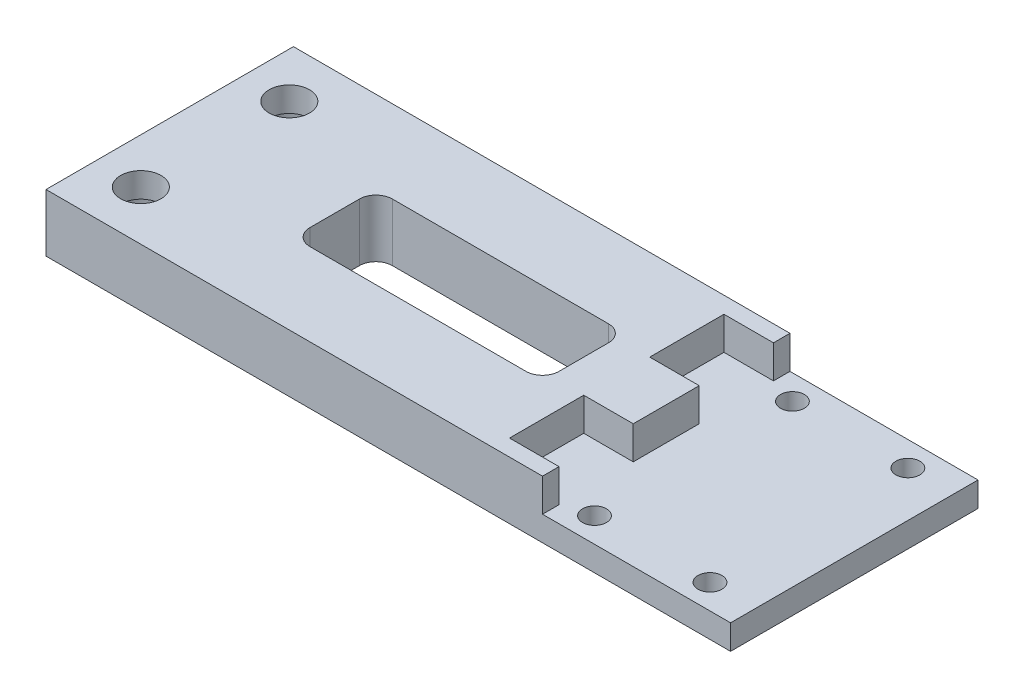
ISO-10303-21;
HEADER;
FILE_DESCRIPTION(('STEP AP214'),'2;1');
FILE_NAME('part.step','',(''),(''),'','','');
FILE_SCHEMA(('AUTOMOTIVE_DESIGN { 1 0 10303 214 1 1 1 1 }'));
ENDSEC;
DATA;
#1=APPLICATION_CONTEXT('core data for automotive mechanical design processes');
#2=APPLICATION_PROTOCOL_DEFINITION('international standard','automotive_design',2000,#1);
#3=PRODUCT_CONTEXT('',#1,'mechanical');
#4=PRODUCT('Part','Part','',(#3));
#5=PRODUCT_RELATED_PRODUCT_CATEGORY('part','',(#4));
#6=PRODUCT_DEFINITION_FORMATION('','',#4);
#7=PRODUCT_DEFINITION_CONTEXT('part definition',#1,'design');
#8=PRODUCT_DEFINITION('design','',#6,#7);
#9=PRODUCT_DEFINITION_SHAPE('','',#8);
#10=(LENGTH_UNIT() NAMED_UNIT(*) SI_UNIT(.MILLI.,.METRE.));
#11=(NAMED_UNIT(*) PLANE_ANGLE_UNIT() SI_UNIT($,.RADIAN.));
#12=(NAMED_UNIT(*) SI_UNIT($,.STERADIAN.) SOLID_ANGLE_UNIT());
#13=UNCERTAINTY_MEASURE_WITH_UNIT(LENGTH_MEASURE(1.E-05),#10,'distance_accuracy_value','');
#14=(GEOMETRIC_REPRESENTATION_CONTEXT(3) GLOBAL_UNCERTAINTY_ASSIGNED_CONTEXT((#13)) GLOBAL_UNIT_ASSIGNED_CONTEXT((#10,
#11,#12)) REPRESENTATION_CONTEXT('',''));
#15=CARTESIAN_POINT('',(0.,0.,0.));
#16=DIRECTION('',(0.,0.,1.));
#17=DIRECTION('',(1.,0.,0.));
#18=AXIS2_PLACEMENT_3D('',#15,#16,#17);
#19=CARTESIAN_POINT('',(-27.8,2.,-30.));
#20=DIRECTION('',(-1.,0.,0.));
#21=DIRECTION('',(0.,0.,1.));
#22=AXIS2_PLACEMENT_3D('',#19,#20,#21);
#23=PLANE('',#22);
#24=DIRECTION('',(0.,0.,1.));
#25=VECTOR('',#24,1.);
#26=CARTESIAN_POINT('',(-27.8,3.,-30.));
#27=LINE('',#26,#25);
#28=CARTESIAN_POINT('',(-27.8,3.,-1.99999999999999));
#29=VERTEX_POINT('',#28);
#30=CARTESIAN_POINT('',(-27.8,3.,0.));
#31=VERTEX_POINT('',#30);
#32=EDGE_CURVE('E193',#29,#31,#27,.T.);
#33=ORIENTED_EDGE('',*,*,#32,.F.);
#34=DIRECTION('',(0.,-1.,0.));
#35=VECTOR('',#34,1.);
#36=CARTESIAN_POINT('',(-27.8,7.,-1.99999999999999));
#37=LINE('',#36,#35);
#38=CARTESIAN_POINT('',(-27.8,7.,-1.99999999999999));
#39=VERTEX_POINT('',#38);
#40=EDGE_CURVE('E204',#39,#29,#37,.T.);
#41=ORIENTED_EDGE('',*,*,#40,.F.);
#42=DIRECTION('',(0.,0.,-1.));
#43=VECTOR('',#42,1.);
#44=CARTESIAN_POINT('',(-27.8,7.,0.));
#45=LINE('',#44,#43);
#46=CARTESIAN_POINT('',(-27.8,7.,0.));
#47=VERTEX_POINT('',#46);
#48=EDGE_CURVE('E263',#47,#39,#45,.T.);
#49=ORIENTED_EDGE('',*,*,#48,.F.);
#50=DIRECTION('',(0.,1.,0.));
#51=VECTOR('',#50,1.);
#52=CARTESIAN_POINT('',(-27.8,2.,0.));
#53=LINE('',#52,#51);
#54=EDGE_CURVE('E212',#31,#47,#53,.T.);
#55=ORIENTED_EDGE('',*,*,#54,.F.);
#56=EDGE_LOOP('',(#33,#41,#49,#55));
#57=FACE_BOUND('',#56,.T.);
#58=ADVANCED_FACE('F37',(#57),#23,.F.);
#59=CARTESIAN_POINT('',(-82.5,-8.,-5.99999999999998));
#60=DIRECTION('',(0.,1.,0.));
#61=DIRECTION('',(0.,0.,1.));
#62=AXIS2_PLACEMENT_3D('',#59,#60,#61);
#63=CYLINDRICAL_SURFACE('',#62,2.45);
#64=CARTESIAN_POINT('',(-82.5,7.,-5.99999999999998));
#65=DIRECTION('',(0.,1.,0.));
#66=DIRECTION('',(0.,0.,1.));
#67=AXIS2_PLACEMENT_3D('',#64,#65,#66);
#68=CIRCLE('',#67,2.45);
#69=CARTESIAN_POINT('',(-82.5,7.,-3.54999999999999));
#70=VERTEX_POINT('',#69);
#71=EDGE_CURVE('E256',#70,#70,#68,.T.);
#72=ORIENTED_EDGE('',*,*,#71,.T.);
#73=EDGE_LOOP('',(#72));
#74=FACE_BOUND('',#73,.T.);
#75=CARTESIAN_POINT('',(-82.5,4.,-5.99999999999998));
#76=DIRECTION('',(0.,-1.,0.));
#77=DIRECTION('',(0.,0.,-1.));
#78=AXIS2_PLACEMENT_3D('',#75,#76,#77);
#79=CIRCLE('',#78,2.45);
#80=CARTESIAN_POINT('',(-82.5,4.,-8.44999999999998));
#81=VERTEX_POINT('',#80);
#82=EDGE_CURVE('E41',#81,#81,#79,.F.);
#83=ORIENTED_EDGE('',*,*,#82,.F.);
#84=EDGE_LOOP('',(#83));
#85=FACE_BOUND('',#84,.T.);
#86=ADVANCED_FACE('F425',(#74,#85),#63,.F.);
#87=CARTESIAN_POINT('',(-82.5,-8.,-24.));
#88=DIRECTION('',(0.,1.,0.));
#89=DIRECTION('',(0.,0.,1.));
#90=AXIS2_PLACEMENT_3D('',#87,#88,#89);
#91=CYLINDRICAL_SURFACE('',#90,2.45);
#92=CARTESIAN_POINT('',(-82.5,7.,-24.));
#93=DIRECTION('',(0.,1.,0.));
#94=DIRECTION('',(0.,0.,1.));
#95=AXIS2_PLACEMENT_3D('',#92,#93,#94);
#96=CIRCLE('',#95,2.45);
#97=CARTESIAN_POINT('',(-82.5,7.,-21.55));
#98=VERTEX_POINT('',#97);
#99=EDGE_CURVE('E253',#98,#98,#96,.T.);
#100=ORIENTED_EDGE('',*,*,#99,.T.);
#101=EDGE_LOOP('',(#100));
#102=FACE_BOUND('',#101,.T.);
#103=CARTESIAN_POINT('',(-82.5,4.,-24.));
#104=DIRECTION('',(0.,-1.,0.));
#105=DIRECTION('',(0.,0.,-1.));
#106=AXIS2_PLACEMENT_3D('',#103,#104,#105);
#107=CIRCLE('',#106,2.45);
#108=CARTESIAN_POINT('',(-82.5,4.,-26.45));
#109=VERTEX_POINT('',#108);
#110=EDGE_CURVE('E335',#109,#109,#107,.F.);
#111=ORIENTED_EDGE('',*,*,#110,.F.);
#112=EDGE_LOOP('',(#111));
#113=FACE_BOUND('',#112,.T.);
#114=ADVANCED_FACE('F402',(#102,#113),#91,.F.);
#115=CARTESIAN_POINT('',(0.,3.,0.));
#116=DIRECTION('',(0.,1.,0.));
#117=DIRECTION('',(0.,0.,1.));
#118=AXIS2_PLACEMENT_3D('',#115,#116,#117);
#119=PLANE('',#118);
#120=CARTESIAN_POINT('',(-10.5,3.,-27.));
#121=DIRECTION('',(0.,1.,0.));
#122=DIRECTION('',(0.,0.,1.));
#123=AXIS2_PLACEMENT_3D('',#120,#121,#122);
#124=CIRCLE('',#123,1.45);
#125=CARTESIAN_POINT('',(-10.5,3.,-25.55));
#126=VERTEX_POINT('',#125);
#127=EDGE_CURVE('E392',#126,#126,#124,.T.);
#128=ORIENTED_EDGE('',*,*,#127,.F.);
#129=EDGE_LOOP('',(#128));
#130=FACE_BOUND('',#129,.T.);
#131=CARTESIAN_POINT('',(-10.5,3.,-3.));
#132=DIRECTION('',(0.,1.,0.));
#133=DIRECTION('',(0.,0.,1.));
#134=AXIS2_PLACEMENT_3D('',#131,#132,#133);
#135=CIRCLE('',#134,1.45);
#136=CARTESIAN_POINT('',(-10.5,3.,-1.55));
#137=VERTEX_POINT('',#136);
#138=EDGE_CURVE('E214',#137,#137,#135,.T.);
#139=ORIENTED_EDGE('',*,*,#138,.F.);
#140=EDGE_LOOP('',(#139));
#141=FACE_BOUND('',#140,.T.);
#142=CARTESIAN_POINT('',(-24.5,3.,-27.));
#143=DIRECTION('',(0.,1.,0.));
#144=DIRECTION('',(0.,0.,1.));
#145=AXIS2_PLACEMENT_3D('',#142,#143,#144);
#146=CIRCLE('',#145,1.45);
#147=CARTESIAN_POINT('',(-24.5,3.,-25.55));
#148=VERTEX_POINT('',#147);
#149=EDGE_CURVE('E218',#148,#148,#146,.T.);
#150=ORIENTED_EDGE('',*,*,#149,.F.);
#151=EDGE_LOOP('',(#150));
#152=FACE_BOUND('',#151,.T.);
#153=CARTESIAN_POINT('',(-24.5,3.,-3.));
#154=DIRECTION('',(0.,1.,0.));
#155=DIRECTION('',(0.,0.,1.));
#156=AXIS2_PLACEMENT_3D('',#153,#154,#155);
#157=CIRCLE('',#156,1.45);
#158=CARTESIAN_POINT('',(-24.5,3.,-1.55));
#159=VERTEX_POINT('',#158);
#160=EDGE_CURVE('E389',#159,#159,#157,.T.);
#161=ORIENTED_EDGE('',*,*,#160,.F.);
#162=EDGE_LOOP('',(#161));
#163=FACE_BOUND('',#162,.T.);
#164=DIRECTION('',(-1.,0.,0.));
#165=VECTOR('',#164,1.);
#166=CARTESIAN_POINT('',(-27.8,3.,-19.));
#167=LINE('',#166,#165);
#168=CARTESIAN_POINT('',(-27.8,3.,-19.));
#169=VERTEX_POINT('',#168);
#170=CARTESIAN_POINT('',(-33.8,3.,-19.));
#171=VERTEX_POINT('',#170);
#172=EDGE_CURVE('E362',#169,#171,#167,.T.);
#173=ORIENTED_EDGE('',*,*,#172,.F.);
#174=CARTESIAN_POINT('',(-27.8,3.,-11.));
#175=VERTEX_POINT('',#174);
#176=EDGE_CURVE('E62',#169,#175,#27,.T.);
#177=ORIENTED_EDGE('',*,*,#176,.T.);
#178=DIRECTION('',(1.,0.,0.));
#179=VECTOR('',#178,1.);
#180=CARTESIAN_POINT('',(-43.6488578017961,3.,-11.));
#181=LINE('',#180,#179);
#182=CARTESIAN_POINT('',(-33.8,3.,-11.));
#183=VERTEX_POINT('',#182);
#184=EDGE_CURVE('E200',#183,#175,#181,.T.);
#185=ORIENTED_EDGE('',*,*,#184,.F.);
#186=DIRECTION('',(0.,0.,1.));
#187=VECTOR('',#186,1.);
#188=CARTESIAN_POINT('',(-33.8,3.,-1.99999999999999));
#189=LINE('',#188,#187);
#190=CARTESIAN_POINT('',(-33.8,3.,-1.99999999999999));
#191=VERTEX_POINT('',#190);
#192=EDGE_CURVE('E197',#183,#191,#189,.T.);
#193=ORIENTED_EDGE('',*,*,#192,.T.);
#194=DIRECTION('',(1.,0.,0.));
#195=VECTOR('',#194,1.);
#196=CARTESIAN_POINT('',(-43.6488578017961,3.,-1.99999999999999));
#197=LINE('',#196,#195);
#198=EDGE_CURVE('E188',#191,#29,#197,.T.);
#199=ORIENTED_EDGE('',*,*,#198,.T.);
#200=ORIENTED_EDGE('',*,*,#32,.T.);
#201=DIRECTION('',(1.,0.,0.));
#202=VECTOR('',#201,1.);
#203=CARTESIAN_POINT('',(-27.8,3.,0.));
#204=LINE('',#203,#202);
#205=CARTESIAN_POINT('',(-5.,3.,0.));
#206=VERTEX_POINT('',#205);
#207=EDGE_CURVE('E216',#31,#206,#204,.T.);
#208=ORIENTED_EDGE('',*,*,#207,.T.);
#209=DIRECTION('',(0.,0.,-1.));
#210=VECTOR('',#209,1.);
#211=CARTESIAN_POINT('',(-5.,3.,0.));
#212=LINE('',#211,#210);
#213=CARTESIAN_POINT('',(-5.,3.,-30.));
#214=VERTEX_POINT('',#213);
#215=EDGE_CURVE('E223',#206,#214,#212,.T.);
#216=ORIENTED_EDGE('',*,*,#215,.T.);
#217=DIRECTION('',(-1.,0.,0.));
#218=VECTOR('',#217,1.);
#219=CARTESIAN_POINT('',(-5.,3.,-30.));
#220=LINE('',#219,#218);
#221=CARTESIAN_POINT('',(-27.8,3.,-30.));
#222=VERTEX_POINT('',#221);
#223=EDGE_CURVE('E226',#214,#222,#220,.T.);
#224=ORIENTED_EDGE('',*,*,#223,.T.);
#225=DIRECTION('',(0.,0.,-1.));
#226=VECTOR('',#225,1.);
#227=CARTESIAN_POINT('',(-27.8,3.,-30.));
#228=LINE('',#227,#226);
#229=CARTESIAN_POINT('',(-27.8,3.,-28.));
#230=VERTEX_POINT('',#229);
#231=EDGE_CURVE('E376',#230,#222,#228,.T.);
#232=ORIENTED_EDGE('',*,*,#231,.F.);
#233=DIRECTION('',(-1.,0.,0.));
#234=VECTOR('',#233,1.);
#235=CARTESIAN_POINT('',(-27.8,3.,-28.));
#236=LINE('',#235,#234);
#237=CARTESIAN_POINT('',(-33.8,3.,-28.));
#238=VERTEX_POINT('',#237);
#239=EDGE_CURVE('E378',#230,#238,#236,.T.);
#240=ORIENTED_EDGE('',*,*,#239,.T.);
#241=DIRECTION('',(0.,0.,-1.));
#242=VECTOR('',#241,1.);
#243=CARTESIAN_POINT('',(-33.8,3.,-30.));
#244=LINE('',#243,#242);
#245=EDGE_CURVE('E385',#171,#238,#244,.T.);
#246=ORIENTED_EDGE('',*,*,#245,.F.);
#247=EDGE_LOOP('',(#173,#177,#185,#193,#199,#200,#208,#216,#224,#232,#240,#246));
#248=FACE_BOUND('',#247,.T.);
#249=ADVANCED_FACE('F190',(#130,#141,#152,#163,#248),#119,.T.);
#250=CARTESIAN_POINT('',(-33.8,0.,0.));
#251=DIRECTION('',(1.,0.,0.));
#252=DIRECTION('',(0.,0.,-1.));
#253=AXIS2_PLACEMENT_3D('',#250,#251,#252);
#254=PLANE('',#253);
#255=DIRECTION('',(0.,1.,0.));
#256=VECTOR('',#255,1.);
#257=CARTESIAN_POINT('',(-33.8,3.,-19.));
#258=LINE('',#257,#256);
#259=CARTESIAN_POINT('',(-33.8,7.,-19.));
#260=VERTEX_POINT('',#259);
#261=EDGE_CURVE('E365',#171,#260,#258,.T.);
#262=ORIENTED_EDGE('',*,*,#261,.F.);
#263=ORIENTED_EDGE('',*,*,#245,.T.);
#264=DIRECTION('',(0.,-1.,0.));
#265=VECTOR('',#264,1.);
#266=CARTESIAN_POINT('',(-33.8,7.,-28.));
#267=LINE('',#266,#265);
#268=CARTESIAN_POINT('',(-33.8,7.,-28.));
#269=VERTEX_POINT('',#268);
#270=EDGE_CURVE('E368',#269,#238,#267,.T.);
#271=ORIENTED_EDGE('',*,*,#270,.F.);
#272=DIRECTION('',(0.,0.,1.));
#273=VECTOR('',#272,1.);
#274=CARTESIAN_POINT('',(-33.8,7.,-30.));
#275=LINE('',#274,#273);
#276=EDGE_CURVE('E387',#269,#260,#275,.T.);
#277=ORIENTED_EDGE('',*,*,#276,.T.);
#278=EDGE_LOOP('',(#262,#263,#271,#277));
#279=FACE_BOUND('',#278,.T.);
#280=ADVANCED_FACE('F401',(#279),#254,.T.);
#281=CARTESIAN_POINT('',(0.,3.,-30.));
#282=DIRECTION('',(0.,0.,1.));
#283=DIRECTION('',(1.,0.,0.));
#284=AXIS2_PLACEMENT_3D('',#281,#282,#283);
#285=PLANE('',#284);
#286=DIRECTION('',(-1.,0.,0.));
#287=VECTOR('',#286,1.);
#288=CARTESIAN_POINT('',(-27.8,7.,-30.));
#289=LINE('',#288,#287);
#290=CARTESIAN_POINT('',(-27.8,7.,-30.));
#291=VERTEX_POINT('',#290);
#292=CARTESIAN_POINT('',(-88.,7.,-30.));
#293=VERTEX_POINT('',#292);
#294=EDGE_CURVE('E265',#291,#293,#289,.T.);
#295=ORIENTED_EDGE('',*,*,#294,.F.);
#296=DIRECTION('',(0.,1.,0.));
#297=VECTOR('',#296,1.);
#298=CARTESIAN_POINT('',(-27.8,7.,-30.));
#299=LINE('',#298,#297);
#300=EDGE_CURVE('E369',#222,#291,#299,.T.);
#301=ORIENTED_EDGE('',*,*,#300,.F.);
#302=ORIENTED_EDGE('',*,*,#223,.F.);
#303=DIRECTION('',(0.,-1.,0.));
#304=VECTOR('',#303,1.);
#305=CARTESIAN_POINT('',(-5.,10.,-30.));
#306=LINE('',#305,#304);
#307=CARTESIAN_POINT('',(-5.,0.,-30.));
#308=VERTEX_POINT('',#307);
#309=EDGE_CURVE('E273',#214,#308,#306,.T.);
#310=ORIENTED_EDGE('',*,*,#309,.T.);
#311=DIRECTION('',(-1.,0.,0.));
#312=VECTOR('',#311,1.);
#313=CARTESIAN_POINT('',(0.,0.,-30.));
#314=LINE('',#313,#312);
#315=CARTESIAN_POINT('',(-88.,0.,-30.));
#316=VERTEX_POINT('',#315);
#317=EDGE_CURVE('E290',#308,#316,#314,.T.);
#318=ORIENTED_EDGE('',*,*,#317,.T.);
#319=DIRECTION('',(0.,-1.,0.));
#320=VECTOR('',#319,1.);
#321=CARTESIAN_POINT('',(-88.,3.,-30.));
#322=LINE('',#321,#320);
#323=EDGE_CURVE('E300',#293,#316,#322,.T.);
#324=ORIENTED_EDGE('',*,*,#323,.F.);
#325=EDGE_LOOP('',(#295,#301,#302,#310,#318,#324));
#326=FACE_BOUND('',#325,.T.);
#327=ADVANCED_FACE('F471',(#326),#285,.F.);
#328=CARTESIAN_POINT('',(-88.,3.,0.));
#329=DIRECTION('',(1.,0.,0.));
#330=DIRECTION('',(0.,0.,-1.));
#331=AXIS2_PLACEMENT_3D('',#328,#329,#330);
#332=PLANE('',#331);
#333=DIRECTION('',(0.,0.,1.));
#334=VECTOR('',#333,1.);
#335=CARTESIAN_POINT('',(-88.,0.,0.));
#336=LINE('',#335,#334);
#337=CARTESIAN_POINT('',(-88.,0.,0.));
#338=VERTEX_POINT('',#337);
#339=EDGE_CURVE('E292',#316,#338,#336,.T.);
#340=ORIENTED_EDGE('',*,*,#339,.T.);
#341=DIRECTION('',(0.,-1.,0.));
#342=VECTOR('',#341,1.);
#343=CARTESIAN_POINT('',(-88.,3.,0.));
#344=LINE('',#343,#342);
#345=CARTESIAN_POINT('',(-88.,7.,0.));
#346=VERTEX_POINT('',#345);
#347=EDGE_CURVE('E297',#346,#338,#344,.T.);
#348=ORIENTED_EDGE('',*,*,#347,.F.);
#349=DIRECTION('',(0.,0.,1.));
#350=VECTOR('',#349,1.);
#351=CARTESIAN_POINT('',(-88.,7.,-30.));
#352=LINE('',#351,#350);
#353=EDGE_CURVE('E267',#293,#346,#352,.T.);
#354=ORIENTED_EDGE('',*,*,#353,.F.);
#355=ORIENTED_EDGE('',*,*,#323,.T.);
#356=EDGE_LOOP('',(#340,#348,#354,#355));
#357=FACE_BOUND('',#356,.T.);
#358=ADVANCED_FACE('F477',(#357),#332,.F.);
#359=CARTESIAN_POINT('',(0.,3.,0.));
#360=DIRECTION('',(0.,0.,-1.));
#361=DIRECTION('',(-1.,0.,0.));
#362=AXIS2_PLACEMENT_3D('',#359,#360,#361);
#363=PLANE('',#362);
#364=ORIENTED_EDGE('',*,*,#207,.F.);
#365=ORIENTED_EDGE('',*,*,#54,.T.);
#366=DIRECTION('',(1.,0.,0.));
#367=VECTOR('',#366,1.);
#368=CARTESIAN_POINT('',(-88.,7.,0.));
#369=LINE('',#368,#367);
#370=EDGE_CURVE('E259',#346,#47,#369,.T.);
#371=ORIENTED_EDGE('',*,*,#370,.F.);
#372=ORIENTED_EDGE('',*,*,#347,.T.);
#373=DIRECTION('',(1.,0.,0.));
#374=VECTOR('',#373,1.);
#375=CARTESIAN_POINT('',(0.,0.,0.));
#376=LINE('',#375,#374);
#377=CARTESIAN_POINT('',(-5.,0.,0.));
#378=VERTEX_POINT('',#377);
#379=EDGE_CURVE('E294',#338,#378,#376,.T.);
#380=ORIENTED_EDGE('',*,*,#379,.T.);
#381=DIRECTION('',(0.,-1.,0.));
#382=VECTOR('',#381,1.);
#383=CARTESIAN_POINT('',(-5.,10.,0.));
#384=LINE('',#383,#382);
#385=EDGE_CURVE('E272',#206,#378,#384,.T.);
#386=ORIENTED_EDGE('',*,*,#385,.F.);
#387=EDGE_LOOP('',(#364,#365,#371,#372,#380,#386));
#388=FACE_BOUND('',#387,.T.);
#389=ADVANCED_FACE('F437',(#388),#363,.F.);
#390=CARTESIAN_POINT('',(0.,0.,0.));
#391=DIRECTION('',(0.,1.,0.));
#392=DIRECTION('',(0.,0.,1.));
#393=AXIS2_PLACEMENT_3D('',#390,#391,#392);
#394=PLANE('',#393);
#395=CARTESIAN_POINT('',(-82.5,0.,-5.99999999999998));
#396=DIRECTION('',(0.,-1.,0.));
#397=DIRECTION('',(0.,0.,-1.));
#398=AXIS2_PLACEMENT_3D('',#395,#396,#397);
#399=CIRCLE('',#398,4.00000000000001);
#400=CARTESIAN_POINT('',(-82.5,0.,-9.99999999999999));
#401=VERTEX_POINT('',#400);
#402=EDGE_CURVE('E343',#401,#401,#399,.T.);
#403=ORIENTED_EDGE('',*,*,#402,.F.);
#404=EDGE_LOOP('',(#403));
#405=FACE_BOUND('',#404,.T.);
#406=CARTESIAN_POINT('',(-82.5,0.,-24.));
#407=DIRECTION('',(0.,-1.,0.));
#408=DIRECTION('',(0.,0.,-1.));
#409=AXIS2_PLACEMENT_3D('',#406,#407,#408);
#410=CIRCLE('',#409,4.00000000000001);
#411=CARTESIAN_POINT('',(-82.5,0.,-28.));
#412=VERTEX_POINT('',#411);
#413=EDGE_CURVE('E354',#412,#412,#410,.T.);
#414=ORIENTED_EDGE('',*,*,#413,.F.);
#415=EDGE_LOOP('',(#414));
#416=FACE_BOUND('',#415,.T.);
#417=DIRECTION('',(0.,0.,-1.));
#418=VECTOR('',#417,1.);
#419=CARTESIAN_POINT('',(-37.8,0.,0.));
#420=LINE('',#419,#418);
#421=CARTESIAN_POINT('',(-37.8,0.,-12.));
#422=VERTEX_POINT('',#421);
#423=CARTESIAN_POINT('',(-37.8,0.,-18.));
#424=VERTEX_POINT('',#423);
#425=EDGE_CURVE('E306',#422,#424,#420,.T.);
#426=ORIENTED_EDGE('',*,*,#425,.T.);
#427=CARTESIAN_POINT('',(-39.8,0.,-18.));
#428=DIRECTION('',(0.,1.,0.));
#429=DIRECTION('',(0.,0.,1.));
#430=AXIS2_PLACEMENT_3D('',#427,#428,#429);
#431=CIRCLE('',#430,2.);
#432=CARTESIAN_POINT('',(-39.8,0.,-20.));
#433=VERTEX_POINT('',#432);
#434=EDGE_CURVE('E46',#424,#433,#431,.T.);
#435=ORIENTED_EDGE('',*,*,#434,.T.);
#436=DIRECTION('',(-1.,0.,0.));
#437=VECTOR('',#436,1.);
#438=CARTESIAN_POINT('',(0.,0.,-20.));
#439=LINE('',#438,#437);
#440=CARTESIAN_POINT('',(-66.,0.,-20.));
#441=VERTEX_POINT('',#440);
#442=EDGE_CURVE('E309',#433,#441,#439,.T.);
#443=ORIENTED_EDGE('',*,*,#442,.T.);
#444=CARTESIAN_POINT('',(-66.,0.,-18.));
#445=DIRECTION('',(0.,1.,0.));
#446=DIRECTION('',(0.,0.,1.));
#447=AXIS2_PLACEMENT_3D('',#444,#445,#446);
#448=CIRCLE('',#447,2.);
#449=CARTESIAN_POINT('',(-68.,0.,-18.));
#450=VERTEX_POINT('',#449);
#451=EDGE_CURVE('E11',#441,#450,#448,.T.);
#452=ORIENTED_EDGE('',*,*,#451,.T.);
#453=DIRECTION('',(0.,0.,1.));
#454=VECTOR('',#453,1.);
#455=CARTESIAN_POINT('',(-68.,0.,0.));
#456=LINE('',#455,#454);
#457=CARTESIAN_POINT('',(-68.,0.,-12.));
#458=VERTEX_POINT('',#457);
#459=EDGE_CURVE('E312',#450,#458,#456,.T.);
#460=ORIENTED_EDGE('',*,*,#459,.T.);
#461=CARTESIAN_POINT('',(-66.,0.,-12.));
#462=DIRECTION('',(0.,1.,0.));
#463=DIRECTION('',(0.,0.,1.));
#464=AXIS2_PLACEMENT_3D('',#461,#462,#463);
#465=CIRCLE('',#464,2.);
#466=CARTESIAN_POINT('',(-66.,0.,-9.99999999999999));
#467=VERTEX_POINT('',#466);
#468=EDGE_CURVE('E331',#458,#467,#465,.T.);
#469=ORIENTED_EDGE('',*,*,#468,.T.);
#470=DIRECTION('',(1.,0.,0.));
#471=VECTOR('',#470,1.);
#472=CARTESIAN_POINT('',(0.,0.,-9.99999999999999));
#473=LINE('',#472,#471);
#474=CARTESIAN_POINT('',(-39.8,0.,-9.99999999999999));
#475=VERTEX_POINT('',#474);
#476=EDGE_CURVE('E303',#467,#475,#473,.T.);
#477=ORIENTED_EDGE('',*,*,#476,.T.);
#478=CARTESIAN_POINT('',(-39.8,0.,-12.));
#479=DIRECTION('',(0.,1.,0.));
#480=DIRECTION('',(0.,0.,1.));
#481=AXIS2_PLACEMENT_3D('',#478,#479,#480);
#482=CIRCLE('',#481,2.);
#483=EDGE_CURVE('E333',#475,#422,#482,.T.);
#484=ORIENTED_EDGE('',*,*,#483,.T.);
#485=EDGE_LOOP('',(#426,#435,#443,#452,#460,#469,#477,#484));
#486=FACE_BOUND('',#485,.T.);
#487=CARTESIAN_POINT('',(-10.5,0.,-27.));
#488=DIRECTION('',(0.,1.,0.));
#489=DIRECTION('',(0.,0.,1.));
#490=AXIS2_PLACEMENT_3D('',#487,#488,#489);
#491=CIRCLE('',#490,1.45);
#492=CARTESIAN_POINT('',(-10.5,0.,-25.55));
#493=VERTEX_POINT('',#492);
#494=EDGE_CURVE('E286',#493,#493,#491,.T.);
#495=ORIENTED_EDGE('',*,*,#494,.T.);
#496=EDGE_LOOP('',(#495));
#497=FACE_BOUND('',#496,.T.);
#498=CARTESIAN_POINT('',(-10.5,0.,-3.));
#499=DIRECTION('',(0.,1.,0.));
#500=DIRECTION('',(0.,0.,1.));
#501=AXIS2_PLACEMENT_3D('',#498,#499,#500);
#502=CIRCLE('',#501,1.45);
#503=CARTESIAN_POINT('',(-10.5,0.,-1.55));
#504=VERTEX_POINT('',#503);
#505=EDGE_CURVE('E283',#504,#504,#502,.T.);
#506=ORIENTED_EDGE('',*,*,#505,.T.);
#507=EDGE_LOOP('',(#506));
#508=FACE_BOUND('',#507,.T.);
#509=CARTESIAN_POINT('',(-24.5,0.,-3.));
#510=DIRECTION('',(0.,1.,0.));
#511=DIRECTION('',(0.,0.,1.));
#512=AXIS2_PLACEMENT_3D('',#509,#510,#511);
#513=CIRCLE('',#512,1.45);
#514=CARTESIAN_POINT('',(-24.5,0.,-1.55));
#515=VERTEX_POINT('',#514);
#516=EDGE_CURVE('E280',#515,#515,#513,.T.);
#517=ORIENTED_EDGE('',*,*,#516,.T.);
#518=EDGE_LOOP('',(#517));
#519=FACE_BOUND('',#518,.T.);
#520=CARTESIAN_POINT('',(-24.5,0.,-27.));
#521=DIRECTION('',(0.,1.,0.));
#522=DIRECTION('',(0.,0.,1.));
#523=AXIS2_PLACEMENT_3D('',#520,#521,#522);
#524=CIRCLE('',#523,1.45);
#525=CARTESIAN_POINT('',(-24.5,0.,-25.55));
#526=VERTEX_POINT('',#525);
#527=EDGE_CURVE('E276',#526,#526,#524,.T.);
#528=ORIENTED_EDGE('',*,*,#527,.T.);
#529=EDGE_LOOP('',(#528));
#530=FACE_BOUND('',#529,.T.);
#531=ORIENTED_EDGE('',*,*,#317,.F.);
#532=DIRECTION('',(0.,0.,-1.));
#533=VECTOR('',#532,1.);
#534=CARTESIAN_POINT('',(-5.,0.,0.));
#535=LINE('',#534,#533);
#536=EDGE_CURVE('E270',#378,#308,#535,.T.);
#537=ORIENTED_EDGE('',*,*,#536,.F.);
#538=ORIENTED_EDGE('',*,*,#379,.F.);
#539=ORIENTED_EDGE('',*,*,#339,.F.);
#540=EDGE_LOOP('',(#531,#537,#538,#539));
#541=FACE_BOUND('',#540,.T.);
#542=ADVANCED_FACE('F433',(#405,#416,#486,#497,#508,#519,#530,#541),#394,.F.);
#543=CARTESIAN_POINT('',(-27.8,7.,-11.));
#544=VERTEX_POINT('',#543);
#545=CARTESIAN_POINT('',(-27.8,7.,-19.));
#546=VERTEX_POINT('',#545);
#547=EDGE_CURVE('E262',#544,#546,#45,.T.);
#548=ORIENTED_EDGE('',*,*,#547,.F.);
#549=DIRECTION('',(0.,1.,0.));
#550=VECTOR('',#549,1.);
#551=CARTESIAN_POINT('',(-27.8,7.,-11.));
#552=LINE('',#551,#550);
#553=EDGE_CURVE('E201',#175,#544,#552,.T.);
#554=ORIENTED_EDGE('',*,*,#553,.F.);
#555=ORIENTED_EDGE('',*,*,#176,.F.);
#556=DIRECTION('',(0.,-1.,0.));
#557=VECTOR('',#556,1.);
#558=CARTESIAN_POINT('',(-27.8,7.,-19.));
#559=LINE('',#558,#557);
#560=EDGE_CURVE('E359',#546,#169,#559,.T.);
#561=ORIENTED_EDGE('',*,*,#560,.F.);
#562=EDGE_LOOP('',(#548,#554,#555,#561));
#563=FACE_BOUND('',#562,.T.);
#564=ADVANCED_FACE('F419',(#563),#23,.F.);
#565=CARTESIAN_POINT('',(-24.5,-9.,-27.));
#566=DIRECTION('',(0.,1.,0.));
#567=DIRECTION('',(0.,0.,1.));
#568=AXIS2_PLACEMENT_3D('',#565,#566,#567);
#569=CYLINDRICAL_SURFACE('',#568,1.45);
#570=ORIENTED_EDGE('',*,*,#527,.F.);
#571=EDGE_LOOP('',(#570));
#572=FACE_BOUND('',#571,.T.);
#573=ORIENTED_EDGE('',*,*,#149,.T.);
#574=EDGE_LOOP('',(#573));
#575=FACE_BOUND('',#574,.T.);
#576=ADVANCED_FACE('F397',(#572,#575),#569,.F.);
#577=CARTESIAN_POINT('',(-24.5,-9.,-3.));
#578=DIRECTION('',(0.,1.,0.));
#579=DIRECTION('',(0.,0.,1.));
#580=AXIS2_PLACEMENT_3D('',#577,#578,#579);
#581=CYLINDRICAL_SURFACE('',#580,1.45);
#582=ORIENTED_EDGE('',*,*,#516,.F.);
#583=EDGE_LOOP('',(#582));
#584=FACE_BOUND('',#583,.T.);
#585=ORIENTED_EDGE('',*,*,#160,.T.);
#586=EDGE_LOOP('',(#585));
#587=FACE_BOUND('',#586,.T.);
#588=ADVANCED_FACE('F407',(#584,#587),#581,.F.);
#589=CARTESIAN_POINT('',(-10.5,-9.,-3.));
#590=DIRECTION('',(0.,1.,0.));
#591=DIRECTION('',(0.,0.,1.));
#592=AXIS2_PLACEMENT_3D('',#589,#590,#591);
#593=CYLINDRICAL_SURFACE('',#592,1.45);
#594=ORIENTED_EDGE('',*,*,#505,.F.);
#595=EDGE_LOOP('',(#594));
#596=FACE_BOUND('',#595,.T.);
#597=ORIENTED_EDGE('',*,*,#138,.T.);
#598=EDGE_LOOP('',(#597));
#599=FACE_BOUND('',#598,.T.);
#600=ADVANCED_FACE('F409',(#596,#599),#593,.F.);
#601=CARTESIAN_POINT('',(-10.5,-9.,-27.));
#602=DIRECTION('',(0.,1.,0.));
#603=DIRECTION('',(0.,0.,1.));
#604=AXIS2_PLACEMENT_3D('',#601,#602,#603);
#605=CYLINDRICAL_SURFACE('',#604,1.45);
#606=ORIENTED_EDGE('',*,*,#494,.F.);
#607=EDGE_LOOP('',(#606));
#608=FACE_BOUND('',#607,.T.);
#609=ORIENTED_EDGE('',*,*,#127,.T.);
#610=EDGE_LOOP('',(#609));
#611=FACE_BOUND('',#610,.T.);
#612=ADVANCED_FACE('F416',(#608,#611),#605,.F.);
#613=CARTESIAN_POINT('',(-68.,-8.,-20.));
#614=DIRECTION('',(-1.,0.,0.));
#615=DIRECTION('',(0.,0.,1.));
#616=AXIS2_PLACEMENT_3D('',#613,#614,#615);
#617=PLANE('',#616);
#618=DIRECTION('',(0.,1.,0.));
#619=VECTOR('',#618,1.);
#620=CARTESIAN_POINT('',(-68.,3.,-18.));
#621=LINE('',#620,#619);
#622=CARTESIAN_POINT('',(-68.,7.,-18.));
#623=VERTEX_POINT('',#622);
#624=EDGE_CURVE('E319',#450,#623,#621,.T.);
#625=ORIENTED_EDGE('',*,*,#624,.T.);
#626=DIRECTION('',(0.,0.,1.));
#627=VECTOR('',#626,1.);
#628=CARTESIAN_POINT('',(-68.,7.,-18.));
#629=LINE('',#628,#627);
#630=CARTESIAN_POINT('',(-68.,7.,-12.));
#631=VERTEX_POINT('',#630);
#632=EDGE_CURVE('E238',#623,#631,#629,.T.);
#633=ORIENTED_EDGE('',*,*,#632,.T.);
#634=DIRECTION('',(0.,1.,0.));
#635=VECTOR('',#634,1.);
#636=CARTESIAN_POINT('',(-68.,0.,-12.));
#637=LINE('',#636,#635);
#638=EDGE_CURVE('E321',#631,#458,#637,.F.);
#639=ORIENTED_EDGE('',*,*,#638,.T.);
#640=ORIENTED_EDGE('',*,*,#459,.F.);
#641=EDGE_LOOP('',(#625,#633,#639,#640));
#642=FACE_BOUND('',#641,.T.);
#643=ADVANCED_FACE('F517',(#642),#617,.F.);
#644=CARTESIAN_POINT('',(-68.,-8.,-20.));
#645=DIRECTION('',(0.,0.,-1.));
#646=DIRECTION('',(-1.,0.,0.));
#647=AXIS2_PLACEMENT_3D('',#644,#645,#646);
#648=PLANE('',#647);
#649=ORIENTED_EDGE('',*,*,#442,.F.);
#650=DIRECTION('',(0.,1.,0.));
#651=VECTOR('',#650,1.);
#652=CARTESIAN_POINT('',(-39.8,3.,-20.));
#653=LINE('',#652,#651);
#654=CARTESIAN_POINT('',(-39.8,7.,-20.));
#655=VERTEX_POINT('',#654);
#656=EDGE_CURVE('E329',#433,#655,#653,.T.);
#657=ORIENTED_EDGE('',*,*,#656,.T.);
#658=DIRECTION('',(-1.,0.,0.));
#659=VECTOR('',#658,1.);
#660=CARTESIAN_POINT('',(-39.8,7.,-20.));
#661=LINE('',#660,#659);
#662=CARTESIAN_POINT('',(-66.,7.,-20.));
#663=VERTEX_POINT('',#662);
#664=EDGE_CURVE('E232',#655,#663,#661,.T.);
#665=ORIENTED_EDGE('',*,*,#664,.T.);
#666=DIRECTION('',(0.,1.,0.));
#667=VECTOR('',#666,1.);
#668=CARTESIAN_POINT('',(-66.,0.,-20.));
#669=LINE('',#668,#667);
#670=EDGE_CURVE('E327',#663,#441,#669,.F.);
#671=ORIENTED_EDGE('',*,*,#670,.T.);
#672=EDGE_LOOP('',(#649,#657,#665,#671));
#673=FACE_BOUND('',#672,.T.);
#674=ADVANCED_FACE('F513',(#673),#648,.F.);
#675=CARTESIAN_POINT('',(-37.8,-8.,-20.));
#676=DIRECTION('',(1.,0.,0.));
#677=DIRECTION('',(0.,0.,-1.));
#678=AXIS2_PLACEMENT_3D('',#675,#676,#677);
#679=PLANE('',#678);
#680=ORIENTED_EDGE('',*,*,#425,.F.);
#681=DIRECTION('',(0.,1.,0.));
#682=VECTOR('',#681,1.);
#683=CARTESIAN_POINT('',(-37.8,3.,-12.));
#684=LINE('',#683,#682);
#685=CARTESIAN_POINT('',(-37.8,7.,-12.));
#686=VERTEX_POINT('',#685);
#687=EDGE_CURVE('E325',#422,#686,#684,.T.);
#688=ORIENTED_EDGE('',*,*,#687,.T.);
#689=DIRECTION('',(0.,0.,-1.));
#690=VECTOR('',#689,1.);
#691=CARTESIAN_POINT('',(-37.8,7.,-12.));
#692=LINE('',#691,#690);
#693=CARTESIAN_POINT('',(-37.8,7.,-18.));
#694=VERTEX_POINT('',#693);
#695=EDGE_CURVE('E250',#686,#694,#692,.T.);
#696=ORIENTED_EDGE('',*,*,#695,.T.);
#697=DIRECTION('',(0.,1.,0.));
#698=VECTOR('',#697,1.);
#699=CARTESIAN_POINT('',(-37.8,0.,-18.));
#700=LINE('',#699,#698);
#701=EDGE_CURVE('E323',#694,#424,#700,.F.);
#702=ORIENTED_EDGE('',*,*,#701,.T.);
#703=EDGE_LOOP('',(#680,#688,#696,#702));
#704=FACE_BOUND('',#703,.T.);
#705=ADVANCED_FACE('F516',(#704),#679,.F.);
#706=CARTESIAN_POINT('',(-68.,-8.,-9.99999999999999));
#707=DIRECTION('',(0.,0.,1.));
#708=DIRECTION('',(1.,0.,0.));
#709=AXIS2_PLACEMENT_3D('',#706,#707,#708);
#710=PLANE('',#709);
#711=ORIENTED_EDGE('',*,*,#476,.F.);
#712=DIRECTION('',(0.,1.,0.));
#713=VECTOR('',#712,1.);
#714=CARTESIAN_POINT('',(-66.,3.,-9.99999999999999));
#715=LINE('',#714,#713);
#716=CARTESIAN_POINT('',(-66.,7.,-9.99999999999999));
#717=VERTEX_POINT('',#716);
#718=EDGE_CURVE('E317',#467,#717,#715,.T.);
#719=ORIENTED_EDGE('',*,*,#718,.T.);
#720=DIRECTION('',(1.,0.,0.));
#721=VECTOR('',#720,1.);
#722=CARTESIAN_POINT('',(-66.,7.,-9.99999999999999));
#723=LINE('',#722,#721);
#724=CARTESIAN_POINT('',(-39.8,7.,-9.99999999999999));
#725=VERTEX_POINT('',#724);
#726=EDGE_CURVE('E244',#717,#725,#723,.T.);
#727=ORIENTED_EDGE('',*,*,#726,.T.);
#728=DIRECTION('',(0.,1.,0.));
#729=VECTOR('',#728,1.);
#730=CARTESIAN_POINT('',(-39.8,0.,-9.99999999999999));
#731=LINE('',#730,#729);
#732=EDGE_CURVE('E315',#725,#475,#731,.F.);
#733=ORIENTED_EDGE('',*,*,#732,.T.);
#734=EDGE_LOOP('',(#711,#719,#727,#733));
#735=FACE_BOUND('',#734,.T.);
#736=ADVANCED_FACE('F521',(#735),#710,.F.);
#737=CARTESIAN_POINT('',(-66.,-8.,-12.));
#738=DIRECTION('',(0.,-1.,0.));
#739=DIRECTION('',(0.,0.,-1.));
#740=AXIS2_PLACEMENT_3D('',#737,#738,#739);
#741=CYLINDRICAL_SURFACE('',#740,2.);
#742=ORIENTED_EDGE('',*,*,#468,.F.);
#743=ORIENTED_EDGE('',*,*,#638,.F.);
#744=CARTESIAN_POINT('',(-66.,7.,-12.));
#745=DIRECTION('',(0.,1.,0.));
#746=DIRECTION('',(0.,0.,1.));
#747=AXIS2_PLACEMENT_3D('',#744,#745,#746);
#748=CIRCLE('',#747,2.);
#749=EDGE_CURVE('E241',#631,#717,#748,.T.);
#750=ORIENTED_EDGE('',*,*,#749,.T.);
#751=ORIENTED_EDGE('',*,*,#718,.F.);
#752=EDGE_LOOP('',(#742,#743,#750,#751));
#753=FACE_BOUND('',#752,.T.);
#754=ADVANCED_FACE('F525',(#753),#741,.F.);
#755=CARTESIAN_POINT('',(-39.8,-8.,-12.));
#756=DIRECTION('',(0.,-1.,0.));
#757=DIRECTION('',(0.,0.,-1.));
#758=AXIS2_PLACEMENT_3D('',#755,#756,#757);
#759=CYLINDRICAL_SURFACE('',#758,2.);
#760=ORIENTED_EDGE('',*,*,#483,.F.);
#761=ORIENTED_EDGE('',*,*,#732,.F.);
#762=CARTESIAN_POINT('',(-39.8,7.,-12.));
#763=DIRECTION('',(0.,1.,0.));
#764=DIRECTION('',(0.,0.,1.));
#765=AXIS2_PLACEMENT_3D('',#762,#763,#764);
#766=CIRCLE('',#765,2.);
#767=EDGE_CURVE('E247',#725,#686,#766,.T.);
#768=ORIENTED_EDGE('',*,*,#767,.T.);
#769=ORIENTED_EDGE('',*,*,#687,.F.);
#770=EDGE_LOOP('',(#760,#761,#768,#769));
#771=FACE_BOUND('',#770,.T.);
#772=ADVANCED_FACE('F555',(#771),#759,.F.);
#773=CARTESIAN_POINT('',(-39.8,-8.,-18.));
#774=DIRECTION('',(0.,-1.,0.));
#775=DIRECTION('',(0.,0.,-1.));
#776=AXIS2_PLACEMENT_3D('',#773,#774,#775);
#777=CYLINDRICAL_SURFACE('',#776,2.);
#778=ORIENTED_EDGE('',*,*,#434,.F.);
#779=ORIENTED_EDGE('',*,*,#701,.F.);
#780=CARTESIAN_POINT('',(-39.8,7.,-18.));
#781=DIRECTION('',(0.,1.,0.));
#782=DIRECTION('',(0.,0.,1.));
#783=AXIS2_PLACEMENT_3D('',#780,#781,#782);
#784=CIRCLE('',#783,2.);
#785=EDGE_CURVE('E229',#694,#655,#784,.T.);
#786=ORIENTED_EDGE('',*,*,#785,.T.);
#787=ORIENTED_EDGE('',*,*,#656,.F.);
#788=EDGE_LOOP('',(#778,#779,#786,#787));
#789=FACE_BOUND('',#788,.T.);
#790=ADVANCED_FACE('F547',(#789),#777,.F.);
#791=CARTESIAN_POINT('',(-66.,-8.,-18.));
#792=DIRECTION('',(0.,-1.,0.));
#793=DIRECTION('',(0.,0.,-1.));
#794=AXIS2_PLACEMENT_3D('',#791,#792,#793);
#795=CYLINDRICAL_SURFACE('',#794,2.);
#796=ORIENTED_EDGE('',*,*,#451,.F.);
#797=ORIENTED_EDGE('',*,*,#670,.F.);
#798=CARTESIAN_POINT('',(-66.,7.,-18.));
#799=DIRECTION('',(0.,1.,0.));
#800=DIRECTION('',(0.,0.,1.));
#801=AXIS2_PLACEMENT_3D('',#798,#799,#800);
#802=CIRCLE('',#801,2.);
#803=EDGE_CURVE('E235',#663,#623,#802,.T.);
#804=ORIENTED_EDGE('',*,*,#803,.T.);
#805=ORIENTED_EDGE('',*,*,#624,.F.);
#806=EDGE_LOOP('',(#796,#797,#804,#805));
#807=FACE_BOUND('',#806,.T.);
#808=ADVANCED_FACE('F39',(#807),#795,.F.);
#809=CARTESIAN_POINT('',(-5.,10.,0.));
#810=DIRECTION('',(-1.,0.,0.));
#811=DIRECTION('',(0.,0.,1.));
#812=AXIS2_PLACEMENT_3D('',#809,#810,#811);
#813=PLANE('',#812);
#814=ORIENTED_EDGE('',*,*,#385,.T.);
#815=ORIENTED_EDGE('',*,*,#536,.T.);
#816=ORIENTED_EDGE('',*,*,#309,.F.);
#817=ORIENTED_EDGE('',*,*,#215,.F.);
#818=EDGE_LOOP('',(#814,#815,#816,#817));
#819=FACE_BOUND('',#818,.T.);
#820=ADVANCED_FACE('F467',(#819),#813,.F.);
#821=CARTESIAN_POINT('',(0.,7.,0.));
#822=DIRECTION('',(0.,1.,0.));
#823=DIRECTION('',(0.,0.,1.));
#824=AXIS2_PLACEMENT_3D('',#821,#822,#823);
#825=PLANE('',#824);
#826=DIRECTION('',(1.,0.,0.));
#827=VECTOR('',#826,1.);
#828=CARTESIAN_POINT('',(-43.6488578017961,7.,-1.99999999999999));
#829=LINE('',#828,#827);
#830=CARTESIAN_POINT('',(-33.8,7.,-1.99999999999999));
#831=VERTEX_POINT('',#830);
#832=EDGE_CURVE('E207',#831,#39,#829,.T.);
#833=ORIENTED_EDGE('',*,*,#832,.F.);
#834=DIRECTION('',(0.,0.,-1.));
#835=VECTOR('',#834,1.);
#836=CARTESIAN_POINT('',(-33.8,7.,-1.99999999999999));
#837=LINE('',#836,#835);
#838=CARTESIAN_POINT('',(-33.8,7.,-11.));
#839=VERTEX_POINT('',#838);
#840=EDGE_CURVE('E447',#831,#839,#837,.T.);
#841=ORIENTED_EDGE('',*,*,#840,.T.);
#842=DIRECTION('',(1.,0.,0.));
#843=VECTOR('',#842,1.);
#844=CARTESIAN_POINT('',(-43.6488578017961,7.,-11.));
#845=LINE('',#844,#843);
#846=EDGE_CURVE('E54',#839,#544,#845,.T.);
#847=ORIENTED_EDGE('',*,*,#846,.T.);
#848=ORIENTED_EDGE('',*,*,#547,.T.);
#849=DIRECTION('',(1.,0.,0.));
#850=VECTOR('',#849,1.);
#851=CARTESIAN_POINT('',(-33.8,7.,-19.));
#852=LINE('',#851,#850);
#853=EDGE_CURVE('E341',#260,#546,#852,.T.);
#854=ORIENTED_EDGE('',*,*,#853,.F.);
#855=ORIENTED_EDGE('',*,*,#276,.F.);
#856=DIRECTION('',(-1.,0.,0.));
#857=VECTOR('',#856,1.);
#858=CARTESIAN_POINT('',(-27.8,7.,-28.));
#859=LINE('',#858,#857);
#860=CARTESIAN_POINT('',(-27.8,7.,-28.));
#861=VERTEX_POINT('',#860);
#862=EDGE_CURVE('E383',#861,#269,#859,.T.);
#863=ORIENTED_EDGE('',*,*,#862,.F.);
#864=DIRECTION('',(0.,0.,1.));
#865=VECTOR('',#864,1.);
#866=CARTESIAN_POINT('',(-27.8,7.,-30.));
#867=LINE('',#866,#865);
#868=EDGE_CURVE('E372',#291,#861,#867,.T.);
#869=ORIENTED_EDGE('',*,*,#868,.F.);
#870=ORIENTED_EDGE('',*,*,#294,.T.);
#871=ORIENTED_EDGE('',*,*,#353,.T.);
#872=ORIENTED_EDGE('',*,*,#370,.T.);
#873=ORIENTED_EDGE('',*,*,#48,.T.);
#874=EDGE_LOOP('',(#833,#841,#847,#848,#854,#855,#863,#869,#870,#871,#872,#873));
#875=FACE_BOUND('',#874,.T.);
#876=ORIENTED_EDGE('',*,*,#71,.F.);
#877=EDGE_LOOP('',(#876));
#878=FACE_BOUND('',#877,.T.);
#879=ORIENTED_EDGE('',*,*,#99,.F.);
#880=EDGE_LOOP('',(#879));
#881=FACE_BOUND('',#880,.T.);
#882=ORIENTED_EDGE('',*,*,#664,.F.);
#883=ORIENTED_EDGE('',*,*,#785,.F.);
#884=ORIENTED_EDGE('',*,*,#695,.F.);
#885=ORIENTED_EDGE('',*,*,#767,.F.);
#886=ORIENTED_EDGE('',*,*,#726,.F.);
#887=ORIENTED_EDGE('',*,*,#749,.F.);
#888=ORIENTED_EDGE('',*,*,#632,.F.);
#889=ORIENTED_EDGE('',*,*,#803,.F.);
#890=EDGE_LOOP('',(#882,#883,#884,#885,#886,#887,#888,#889));
#891=FACE_BOUND('',#890,.T.);
#892=ADVANCED_FACE('F442',(#875,#878,#881,#891),#825,.T.);
#893=CARTESIAN_POINT('',(-27.8,7.,-28.));
#894=DIRECTION('',(0.,0.,-1.));
#895=DIRECTION('',(-1.,0.,0.));
#896=AXIS2_PLACEMENT_3D('',#893,#894,#895);
#897=PLANE('',#896);
#898=ORIENTED_EDGE('',*,*,#270,.T.);
#899=ORIENTED_EDGE('',*,*,#239,.F.);
#900=DIRECTION('',(0.,-1.,0.));
#901=VECTOR('',#900,1.);
#902=CARTESIAN_POINT('',(-27.8,7.,-28.));
#903=LINE('',#902,#901);
#904=EDGE_CURVE('E374',#861,#230,#903,.T.);
#905=ORIENTED_EDGE('',*,*,#904,.F.);
#906=ORIENTED_EDGE('',*,*,#862,.T.);
#907=EDGE_LOOP('',(#898,#899,#905,#906));
#908=FACE_BOUND('',#907,.T.);
#909=ADVANCED_FACE('F487',(#908),#897,.F.);
#910=CARTESIAN_POINT('',(-27.8,0.,0.));
#911=DIRECTION('',(-1.,0.,0.));
#912=DIRECTION('',(0.,0.,1.));
#913=AXIS2_PLACEMENT_3D('',#910,#911,#912);
#914=PLANE('',#913);
#915=ORIENTED_EDGE('',*,*,#300,.T.);
#916=ORIENTED_EDGE('',*,*,#868,.T.);
#917=ORIENTED_EDGE('',*,*,#904,.T.);
#918=ORIENTED_EDGE('',*,*,#231,.T.);
#919=EDGE_LOOP('',(#915,#916,#917,#918));
#920=FACE_BOUND('',#919,.T.);
#921=ADVANCED_FACE('F482',(#920),#914,.F.);
#922=CARTESIAN_POINT('',(0.,0.,-19.));
#923=DIRECTION('',(0.,0.,-1.));
#924=DIRECTION('',(-1.,0.,0.));
#925=AXIS2_PLACEMENT_3D('',#922,#923,#924);
#926=PLANE('',#925);
#927=ORIENTED_EDGE('',*,*,#853,.T.);
#928=ORIENTED_EDGE('',*,*,#560,.T.);
#929=ORIENTED_EDGE('',*,*,#172,.T.);
#930=ORIENTED_EDGE('',*,*,#261,.T.);
#931=EDGE_LOOP('',(#927,#928,#929,#930));
#932=FACE_BOUND('',#931,.T.);
#933=ADVANCED_FACE('F491',(#932),#926,.T.);
#934=CARTESIAN_POINT('',(-82.5,4.,-24.));
#935=DIRECTION('',(0.,-1.,0.));
#936=DIRECTION('',(0.,0.,-1.));
#937=AXIS2_PLACEMENT_3D('',#934,#935,#936);
#938=PLANE('',#937);
#939=CARTESIAN_POINT('',(-82.5,4.,-24.));
#940=DIRECTION('',(0.,-1.,0.));
#941=DIRECTION('',(0.,0.,-1.));
#942=AXIS2_PLACEMENT_3D('',#939,#940,#941);
#943=CIRCLE('',#942,4.00000000000001);
#944=CARTESIAN_POINT('',(-82.5,4.,-28.));
#945=VERTEX_POINT('',#944);
#946=EDGE_CURVE('E348',#945,#945,#943,.T.);
#947=ORIENTED_EDGE('',*,*,#946,.T.);
#948=EDGE_LOOP('',(#947));
#949=FACE_BOUND('',#948,.T.);
#950=ORIENTED_EDGE('',*,*,#110,.T.);
#951=EDGE_LOOP('',(#950));
#952=FACE_BOUND('',#951,.T.);
#953=ADVANCED_FACE('F493',(#949,#952),#938,.T.);
#954=CARTESIAN_POINT('',(-82.5,4.,-24.));
#955=DIRECTION('',(0.,-1.,0.));
#956=DIRECTION('',(0.,0.,-1.));
#957=AXIS2_PLACEMENT_3D('',#954,#955,#956);
#958=CYLINDRICAL_SURFACE('',#957,4.00000000000001);
#959=ORIENTED_EDGE('',*,*,#946,.F.);
#960=EDGE_LOOP('',(#959));
#961=FACE_BOUND('',#960,.T.);
#962=ORIENTED_EDGE('',*,*,#413,.T.);
#963=EDGE_LOOP('',(#962));
#964=FACE_BOUND('',#963,.T.);
#965=ADVANCED_FACE('F499',(#961,#964),#958,.F.);
#966=CARTESIAN_POINT('',(-82.5,4.,-5.99999999999998));
#967=DIRECTION('',(0.,-1.,0.));
#968=DIRECTION('',(0.,0.,-1.));
#969=AXIS2_PLACEMENT_3D('',#966,#967,#968);
#970=PLANE('',#969);
#971=CARTESIAN_POINT('',(-82.5,4.,-5.99999999999998));
#972=DIRECTION('',(0.,-1.,0.));
#973=DIRECTION('',(0.,0.,-1.));
#974=AXIS2_PLACEMENT_3D('',#971,#972,#973);
#975=CIRCLE('',#974,4.00000000000001);
#976=CARTESIAN_POINT('',(-82.5,4.,-9.99999999999999));
#977=VERTEX_POINT('',#976);
#978=EDGE_CURVE('E337',#977,#977,#975,.T.);
#979=ORIENTED_EDGE('',*,*,#978,.T.);
#980=EDGE_LOOP('',(#979));
#981=FACE_BOUND('',#980,.T.);
#982=ORIENTED_EDGE('',*,*,#82,.T.);
#983=EDGE_LOOP('',(#982));
#984=FACE_BOUND('',#983,.T.);
#985=ADVANCED_FACE('F691',(#981,#984),#970,.T.);
#986=CARTESIAN_POINT('',(-82.5,4.,-5.99999999999998));
#987=DIRECTION('',(0.,-1.,0.));
#988=DIRECTION('',(0.,0.,-1.));
#989=AXIS2_PLACEMENT_3D('',#986,#987,#988);
#990=CYLINDRICAL_SURFACE('',#989,4.00000000000001);
#991=ORIENTED_EDGE('',*,*,#978,.F.);
#992=EDGE_LOOP('',(#991));
#993=FACE_BOUND('',#992,.T.);
#994=ORIENTED_EDGE('',*,*,#402,.T.);
#995=EDGE_LOOP('',(#994));
#996=FACE_BOUND('',#995,.T.);
#997=ADVANCED_FACE('F700',(#993,#996),#990,.F.);
#998=CARTESIAN_POINT('',(-43.6488578017961,7.,-1.99999999999999));
#999=DIRECTION('',(0.,0.,1.));
#1000=DIRECTION('',(1.,0.,0.));
#1001=AXIS2_PLACEMENT_3D('',#998,#999,#1000);
#1002=PLANE('',#1001);
#1003=DIRECTION('',(0.,1.,0.));
#1004=VECTOR('',#1003,1.);
#1005=CARTESIAN_POINT('',(-33.8,7.,-1.99999999999999));
#1006=LINE('',#1005,#1004);
#1007=EDGE_CURVE('E454',#191,#831,#1006,.T.);
#1008=ORIENTED_EDGE('',*,*,#1007,.T.);
#1009=ORIENTED_EDGE('',*,*,#832,.T.);
#1010=ORIENTED_EDGE('',*,*,#40,.T.);
#1011=ORIENTED_EDGE('',*,*,#198,.F.);
#1012=EDGE_LOOP('',(#1008,#1009,#1010,#1011));
#1013=FACE_BOUND('',#1012,.T.);
#1014=ADVANCED_FACE('F205',(#1013),#1002,.F.);
#1015=CARTESIAN_POINT('',(-43.6488578017961,7.,-11.));
#1016=DIRECTION('',(0.,0.,-1.));
#1017=DIRECTION('',(0.,1.,0.));
#1018=AXIS2_PLACEMENT_3D('',#1015,#1016,#1017);
#1019=PLANE('',#1018);
#1020=DIRECTION('',(0.,-1.,0.));
#1021=VECTOR('',#1020,1.);
#1022=CARTESIAN_POINT('',(-33.8,7.,-11.));
#1023=LINE('',#1022,#1021);
#1024=EDGE_CURVE('E449',#839,#183,#1023,.T.);
#1025=ORIENTED_EDGE('',*,*,#1024,.T.);
#1026=ORIENTED_EDGE('',*,*,#184,.T.);
#1027=ORIENTED_EDGE('',*,*,#553,.T.);
#1028=ORIENTED_EDGE('',*,*,#846,.F.);
#1029=EDGE_LOOP('',(#1025,#1026,#1027,#1028));
#1030=FACE_BOUND('',#1029,.T.);
#1031=ADVANCED_FACE('F457',(#1030),#1019,.F.);
#1032=CARTESIAN_POINT('',(-33.8,0.,0.));
#1033=DIRECTION('',(1.,0.,0.));
#1034=DIRECTION('',(0.,0.,-1.));
#1035=AXIS2_PLACEMENT_3D('',#1032,#1033,#1034);
#1036=PLANE('',#1035);
#1037=ORIENTED_EDGE('',*,*,#1007,.F.);
#1038=ORIENTED_EDGE('',*,*,#192,.F.);
#1039=ORIENTED_EDGE('',*,*,#1024,.F.);
#1040=ORIENTED_EDGE('',*,*,#840,.F.);
#1041=EDGE_LOOP('',(#1037,#1038,#1039,#1040));
#1042=FACE_BOUND('',#1041,.T.);
#1043=ADVANCED_FACE('F459',(#1042),#1036,.T.);
#1044=CLOSED_SHELL('',(#58,#86,#114,#249,#280,#327,#358,#389,#542,#564,#576,#588,#600,#612,#643,
#674,#705,#736,#754,#772,#790,#808,#820,#892,#909,#921,#933,#953,#965,#985,#997,#1014,#1031,#1043));
#1045=MANIFOLD_SOLID_BREP('B2',#1044);
#1046=ADVANCED_BREP_SHAPE_REPRESENTATION('',(#18,#1045),#14);
#1047=SHAPE_DEFINITION_REPRESENTATION(#9,#1046);
ENDSEC;
END-ISO-10303-21;
